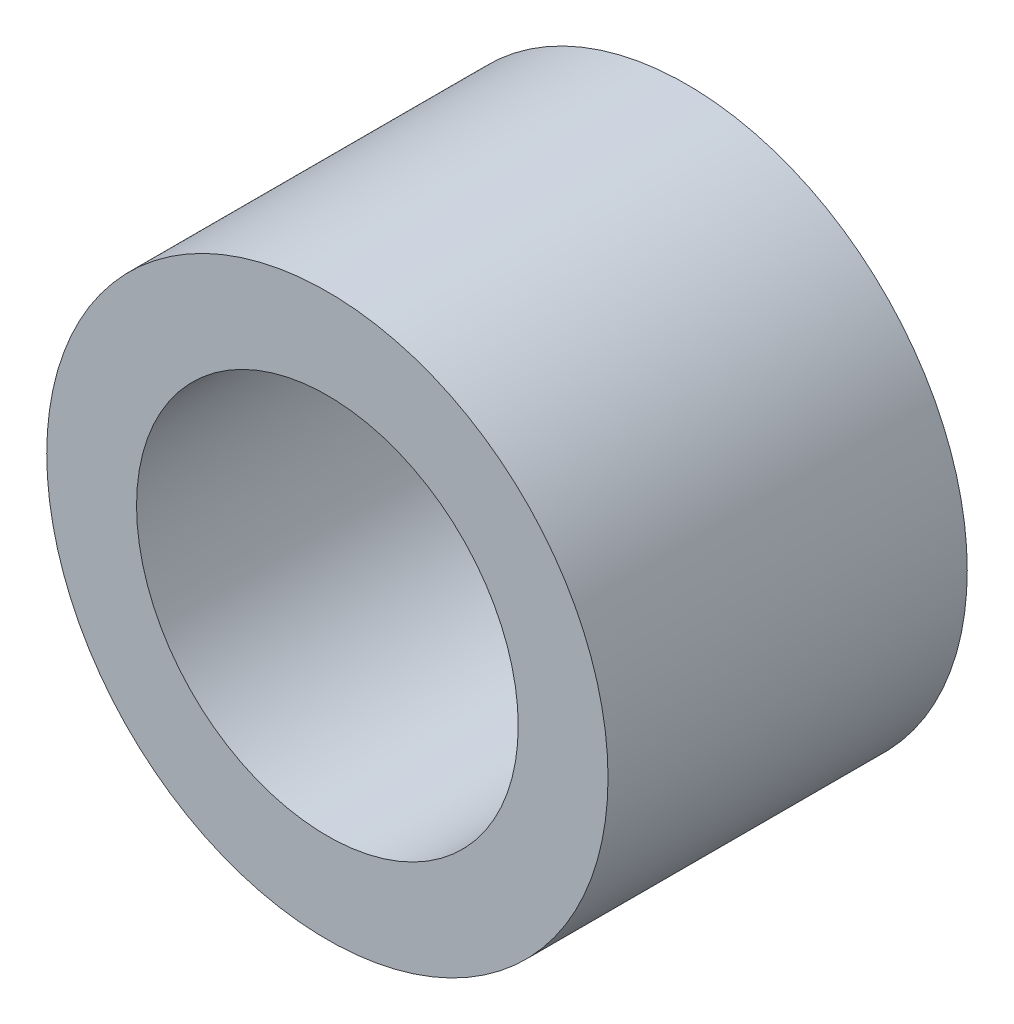
ISO-10303-21;
HEADER;
FILE_DESCRIPTION(('STEP AP214'),'2;1');
FILE_NAME('part.step','',(''),(''),'','','');
FILE_SCHEMA(('AUTOMOTIVE_DESIGN { 1 0 10303 214 1 1 1 1 }'));
ENDSEC;
DATA;
#1=APPLICATION_CONTEXT('core data for automotive mechanical design processes');
#2=APPLICATION_PROTOCOL_DEFINITION('international standard','automotive_design',2000,#1);
#3=PRODUCT_CONTEXT('',#1,'mechanical');
#4=PRODUCT('Part','Part','',(#3));
#5=PRODUCT_RELATED_PRODUCT_CATEGORY('part','',(#4));
#6=PRODUCT_DEFINITION_FORMATION('','',#4);
#7=PRODUCT_DEFINITION_CONTEXT('part definition',#1,'design');
#8=PRODUCT_DEFINITION('design','',#6,#7);
#9=PRODUCT_DEFINITION_SHAPE('','',#8);
#10=(LENGTH_UNIT() NAMED_UNIT(*) SI_UNIT(.MILLI.,.METRE.));
#11=(NAMED_UNIT(*) PLANE_ANGLE_UNIT() SI_UNIT($,.RADIAN.));
#12=(NAMED_UNIT(*) SI_UNIT($,.STERADIAN.) SOLID_ANGLE_UNIT());
#13=UNCERTAINTY_MEASURE_WITH_UNIT(LENGTH_MEASURE(1.E-05),#10,'distance_accuracy_value','');
#14=(GEOMETRIC_REPRESENTATION_CONTEXT(3) GLOBAL_UNCERTAINTY_ASSIGNED_CONTEXT((#13)) GLOBAL_UNIT_ASSIGNED_CONTEXT((#10,
#11,#12)) REPRESENTATION_CONTEXT('',''));
#15=CARTESIAN_POINT('',(0.,0.,0.));
#16=DIRECTION('',(0.,0.,1.));
#17=DIRECTION('',(1.,0.,0.));
#18=AXIS2_PLACEMENT_3D('',#15,#16,#17);
#19=CARTESIAN_POINT('',(0.,0.,71.5));
#20=DIRECTION('',(0.,0.,1.));
#21=DIRECTION('',(1.,0.,0.));
#22=AXIS2_PLACEMENT_3D('',#19,#20,#21);
#23=PLANE('',#22);
#24=CARTESIAN_POINT('',(0.,0.,71.5));
#25=DIRECTION('',(0.,0.,1.));
#26=DIRECTION('',(1.,0.,0.));
#27=AXIS2_PLACEMENT_3D('',#24,#25,#26);
#28=CIRCLE('',#27,12.5);
#29=CARTESIAN_POINT('',(12.5,0.,71.5));
#30=VERTEX_POINT('',#29);
#31=EDGE_CURVE('E10',#30,#30,#28,.T.);
#32=ORIENTED_EDGE('',*,*,#31,.T.);
#33=EDGE_LOOP('',(#32));
#34=FACE_BOUND('',#33,.T.);
#35=CARTESIAN_POINT('',(0.,0.,71.5));
#36=DIRECTION('',(0.,0.,1.));
#37=DIRECTION('',(1.,0.,0.));
#38=AXIS2_PLACEMENT_3D('',#35,#36,#37);
#39=CIRCLE('',#38,8.5);
#40=CARTESIAN_POINT('',(8.5,0.,71.5));
#41=VERTEX_POINT('',#40);
#42=EDGE_CURVE('E50',#41,#41,#39,.T.);
#43=ORIENTED_EDGE('',*,*,#42,.F.);
#44=EDGE_LOOP('',(#43));
#45=FACE_BOUND('',#44,.T.);
#46=ADVANCED_FACE('F36',(#34,#45),#23,.T.);
#47=CARTESIAN_POINT('',(0.,0.,55.5));
#48=DIRECTION('',(0.,0.,1.));
#49=DIRECTION('',(1.,0.,0.));
#50=AXIS2_PLACEMENT_3D('',#47,#48,#49);
#51=PLANE('',#50);
#52=CARTESIAN_POINT('',(0.,0.,55.5));
#53=DIRECTION('',(0.,0.,1.));
#54=DIRECTION('',(1.,0.,0.));
#55=AXIS2_PLACEMENT_3D('',#52,#53,#54);
#56=CIRCLE('',#55,12.5);
#57=CARTESIAN_POINT('',(12.5,0.,55.5));
#58=VERTEX_POINT('',#57);
#59=EDGE_CURVE('E40',#58,#58,#56,.T.);
#60=ORIENTED_EDGE('',*,*,#59,.F.);
#61=EDGE_LOOP('',(#60));
#62=FACE_BOUND('',#61,.T.);
#63=CARTESIAN_POINT('',(0.,0.,55.5));
#64=DIRECTION('',(0.,0.,1.));
#65=DIRECTION('',(1.,0.,0.));
#66=AXIS2_PLACEMENT_3D('',#63,#64,#65);
#67=CIRCLE('',#66,8.5);
#68=CARTESIAN_POINT('',(8.5,0.,55.5));
#69=VERTEX_POINT('',#68);
#70=EDGE_CURVE('E52',#69,#69,#67,.T.);
#71=ORIENTED_EDGE('',*,*,#70,.T.);
#72=EDGE_LOOP('',(#71));
#73=FACE_BOUND('',#72,.T.);
#74=ADVANCED_FACE('F63',(#62,#73),#51,.F.);
#75=CARTESIAN_POINT('',(0.,0.,71.5));
#76=DIRECTION('',(0.,0.,-1.));
#77=DIRECTION('',(-1.,0.,0.));
#78=AXIS2_PLACEMENT_3D('',#75,#76,#77);
#79=CYLINDRICAL_SURFACE('',#78,12.5);
#80=ORIENTED_EDGE('',*,*,#31,.F.);
#81=EDGE_LOOP('',(#80));
#82=FACE_BOUND('',#81,.T.);
#83=ORIENTED_EDGE('',*,*,#59,.T.);
#84=EDGE_LOOP('',(#83));
#85=FACE_BOUND('',#84,.T.);
#86=ADVANCED_FACE('F38',(#82,#85),#79,.T.);
#87=CARTESIAN_POINT('',(0.,0.,71.5));
#88=DIRECTION('',(0.,0.,-1.));
#89=DIRECTION('',(-1.,0.,0.));
#90=AXIS2_PLACEMENT_3D('',#87,#88,#89);
#91=CYLINDRICAL_SURFACE('',#90,8.5);
#92=ORIENTED_EDGE('',*,*,#42,.T.);
#93=EDGE_LOOP('',(#92));
#94=FACE_BOUND('',#93,.T.);
#95=ORIENTED_EDGE('',*,*,#70,.F.);
#96=EDGE_LOOP('',(#95));
#97=FACE_BOUND('',#96,.T.);
#98=ADVANCED_FACE('F59',(#94,#97),#91,.F.);
#99=CLOSED_SHELL('',(#46,#74,#86,#98));
#100=MANIFOLD_SOLID_BREP('B2',#99);
#101=ADVANCED_BREP_SHAPE_REPRESENTATION('',(#18,#100),#14);
#102=SHAPE_DEFINITION_REPRESENTATION(#9,#101);
ENDSEC;
END-ISO-10303-21;
